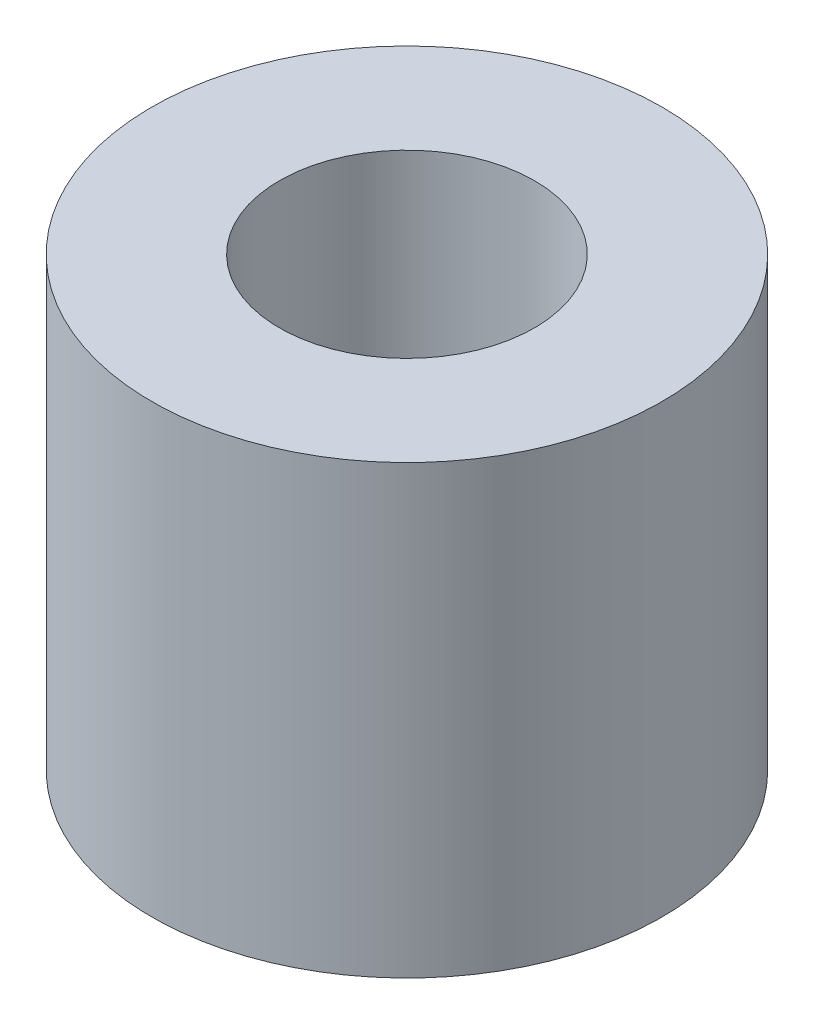
ISO-10303-21;
HEADER;
FILE_DESCRIPTION(('STEP AP214'),'2;1');
FILE_NAME('part.step','',(''),(''),'','','');
FILE_SCHEMA(('AUTOMOTIVE_DESIGN { 1 0 10303 214 1 1 1 1 }'));
ENDSEC;
DATA;
#1=APPLICATION_CONTEXT('core data for automotive mechanical design processes');
#2=APPLICATION_PROTOCOL_DEFINITION('international standard','automotive_design',2000,#1);
#3=PRODUCT_CONTEXT('',#1,'mechanical');
#4=PRODUCT('Part','Part','',(#3));
#5=PRODUCT_RELATED_PRODUCT_CATEGORY('part','',(#4));
#6=PRODUCT_DEFINITION_FORMATION('','',#4);
#7=PRODUCT_DEFINITION_CONTEXT('part definition',#1,'design');
#8=PRODUCT_DEFINITION('design','',#6,#7);
#9=PRODUCT_DEFINITION_SHAPE('','',#8);
#10=(LENGTH_UNIT() NAMED_UNIT(*) SI_UNIT(.MILLI.,.METRE.));
#11=(NAMED_UNIT(*) PLANE_ANGLE_UNIT() SI_UNIT($,.RADIAN.));
#12=(NAMED_UNIT(*) SI_UNIT($,.STERADIAN.) SOLID_ANGLE_UNIT());
#13=UNCERTAINTY_MEASURE_WITH_UNIT(LENGTH_MEASURE(1.E-05),#10,'distance_accuracy_value','');
#14=(GEOMETRIC_REPRESENTATION_CONTEXT(3) GLOBAL_UNCERTAINTY_ASSIGNED_CONTEXT((#13)) GLOBAL_UNIT_ASSIGNED_CONTEXT((#10,
#11,#12)) REPRESENTATION_CONTEXT('',''));
#15=CARTESIAN_POINT('',(0.,0.,0.));
#16=DIRECTION('',(0.,0.,1.));
#17=DIRECTION('',(1.,0.,0.));
#18=AXIS2_PLACEMENT_3D('',#15,#16,#17);
#19=CARTESIAN_POINT('',(0.,5.25,0.));
#20=DIRECTION('',(0.,1.,0.));
#21=DIRECTION('',(0.,0.,1.));
#22=AXIS2_PLACEMENT_3D('',#19,#20,#21);
#23=PLANE('',#22);
#24=CARTESIAN_POINT('',(0.,5.25,0.));
#25=DIRECTION('',(0.,1.,0.));
#26=DIRECTION('',(0.,0.,1.));
#27=AXIS2_PLACEMENT_3D('',#24,#25,#26);
#28=CIRCLE('',#27,3.);
#29=CARTESIAN_POINT('',(0.,5.25,-3.));
#30=VERTEX_POINT('',#29);
#31=EDGE_CURVE('E10',#30,#30,#28,.T.);
#32=ORIENTED_EDGE('',*,*,#31,.T.);
#33=EDGE_LOOP('',(#32));
#34=FACE_BOUND('',#33,.T.);
#35=CARTESIAN_POINT('',(0.,5.25,0.));
#36=DIRECTION('',(0.,1.,0.));
#37=DIRECTION('',(0.,0.,1.));
#38=AXIS2_PLACEMENT_3D('',#35,#36,#37);
#39=CIRCLE('',#38,1.5);
#40=CARTESIAN_POINT('',(0.,5.25,-1.5));
#41=VERTEX_POINT('',#40);
#42=EDGE_CURVE('E56',#41,#41,#39,.T.);
#43=ORIENTED_EDGE('',*,*,#42,.F.);
#44=EDGE_LOOP('',(#43));
#45=FACE_BOUND('',#44,.T.);
#46=ADVANCED_FACE('F43',(#34,#45),#23,.T.);
#47=CARTESIAN_POINT('',(0.,0.,0.));
#48=DIRECTION('',(0.,1.,0.));
#49=DIRECTION('',(0.,0.,1.));
#50=AXIS2_PLACEMENT_3D('',#47,#48,#49);
#51=PLANE('',#50);
#52=CARTESIAN_POINT('',(0.,0.,0.));
#53=DIRECTION('',(0.,1.,0.));
#54=DIRECTION('',(0.,0.,1.));
#55=AXIS2_PLACEMENT_3D('',#52,#53,#54);
#56=CIRCLE('',#55,3.);
#57=CARTESIAN_POINT('',(0.,0.,-3.));
#58=VERTEX_POINT('',#57);
#59=EDGE_CURVE('E47',#58,#58,#56,.T.);
#60=ORIENTED_EDGE('',*,*,#59,.F.);
#61=EDGE_LOOP('',(#60));
#62=FACE_BOUND('',#61,.T.);
#63=CARTESIAN_POINT('',(0.,0.,0.));
#64=DIRECTION('',(0.,1.,0.));
#65=DIRECTION('',(0.,0.,1.));
#66=AXIS2_PLACEMENT_3D('',#63,#64,#65);
#67=CIRCLE('',#66,1.5);
#68=CARTESIAN_POINT('',(0.,0.,-1.5));
#69=VERTEX_POINT('',#68);
#70=EDGE_CURVE('E58',#69,#69,#67,.T.);
#71=ORIENTED_EDGE('',*,*,#70,.T.);
#72=EDGE_LOOP('',(#71));
#73=FACE_BOUND('',#72,.T.);
#74=ADVANCED_FACE('F70',(#62,#73),#51,.F.);
#75=CARTESIAN_POINT('',(0.,5.25,0.));
#76=DIRECTION('',(0.,-1.,0.));
#77=DIRECTION('',(0.,0.,-1.));
#78=AXIS2_PLACEMENT_3D('',#75,#76,#77);
#79=CYLINDRICAL_SURFACE('',#78,3.);
#80=CARTESIAN_POINT('',(0.,5.25,-3.));
#81=CARTESIAN_POINT('',(0.,5.1953125,-3.));
#82=CARTESIAN_POINT('',(0.,5.140625,-3.));
#83=CARTESIAN_POINT('',(0.,5.03125,-3.));
#84=CARTESIAN_POINT('',(0.,4.9765625,-3.));
#85=CARTESIAN_POINT('',(0.,4.8671875,-3.));
#86=CARTESIAN_POINT('',(0.,4.8125,-3.));
#87=CARTESIAN_POINT('',(0.,4.703125,-3.));
#88=CARTESIAN_POINT('',(0.,4.6484375,-3.));
#89=CARTESIAN_POINT('',(0.,4.5390625,-3.));
#90=CARTESIAN_POINT('',(0.,4.484375,-3.));
#91=CARTESIAN_POINT('',(0.,4.375,-3.));
#92=CARTESIAN_POINT('',(0.,4.3203125,-3.));
#93=CARTESIAN_POINT('',(0.,4.2109375,-3.));
#94=CARTESIAN_POINT('',(0.,4.15625,-3.));
#95=CARTESIAN_POINT('',(0.,4.046875,-3.));
#96=CARTESIAN_POINT('',(0.,3.9921875,-3.));
#97=CARTESIAN_POINT('',(0.,3.8828125,-3.));
#98=CARTESIAN_POINT('',(0.,3.828125,-3.));
#99=CARTESIAN_POINT('',(0.,3.71875,-3.));
#100=CARTESIAN_POINT('',(0.,3.6640625,-3.));
#101=CARTESIAN_POINT('',(0.,3.5546875,-3.));
#102=CARTESIAN_POINT('',(0.,3.5,-3.));
#103=CARTESIAN_POINT('',(0.,3.390625,-3.));
#104=CARTESIAN_POINT('',(0.,3.3359375,-3.));
#105=CARTESIAN_POINT('',(0.,3.2265625,-3.));
#106=CARTESIAN_POINT('',(0.,3.171875,-3.));
#107=CARTESIAN_POINT('',(0.,3.0625,-3.));
#108=CARTESIAN_POINT('',(0.,3.0078125,-3.));
#109=CARTESIAN_POINT('',(0.,2.8984375,-3.));
#110=CARTESIAN_POINT('',(0.,2.84375,-3.));
#111=CARTESIAN_POINT('',(0.,2.734375,-3.));
#112=CARTESIAN_POINT('',(0.,2.6796875,-3.));
#113=CARTESIAN_POINT('',(0.,2.5703125,-3.));
#114=CARTESIAN_POINT('',(0.,2.515625,-3.));
#115=CARTESIAN_POINT('',(0.,2.40625,-3.));
#116=CARTESIAN_POINT('',(0.,2.3515625,-3.));
#117=CARTESIAN_POINT('',(0.,2.2421875,-3.));
#118=CARTESIAN_POINT('',(0.,2.1875,-3.));
#119=CARTESIAN_POINT('',(0.,2.078125,-3.));
#120=CARTESIAN_POINT('',(0.,2.0234375,-3.));
#121=CARTESIAN_POINT('',(0.,1.9140625,-3.));
#122=CARTESIAN_POINT('',(0.,1.859375,-3.));
#123=CARTESIAN_POINT('',(0.,1.75,-3.));
#124=CARTESIAN_POINT('',(0.,1.6953125,-3.));
#125=CARTESIAN_POINT('',(0.,1.5859375,-3.));
#126=CARTESIAN_POINT('',(0.,1.53125,-3.));
#127=CARTESIAN_POINT('',(0.,1.421875,-3.));
#128=CARTESIAN_POINT('',(0.,1.3671875,-3.));
#129=CARTESIAN_POINT('',(0.,1.2578125,-3.));
#130=CARTESIAN_POINT('',(0.,1.203125,-3.));
#131=CARTESIAN_POINT('',(0.,1.09375,-3.));
#132=CARTESIAN_POINT('',(0.,1.0390625,-3.));
#133=CARTESIAN_POINT('',(0.,0.9296875,-3.));
#134=CARTESIAN_POINT('',(0.,0.875,-3.));
#135=CARTESIAN_POINT('',(0.,0.765625,-3.));
#136=CARTESIAN_POINT('',(0.,0.7109375,-3.));
#137=CARTESIAN_POINT('',(0.,0.6015625,-3.));
#138=CARTESIAN_POINT('',(0.,0.546875,-3.));
#139=CARTESIAN_POINT('',(0.,0.4375,-3.));
#140=CARTESIAN_POINT('',(0.,0.3828125,-3.));
#141=CARTESIAN_POINT('',(0.,0.2734375,-3.));
#142=CARTESIAN_POINT('',(0.,0.21875,-3.));
#143=CARTESIAN_POINT('',(0.,0.109375,-3.));
#144=CARTESIAN_POINT('',(0.,0.0546875,-3.));
#145=CARTESIAN_POINT('',(0.,0.,-3.));
#146=B_SPLINE_CURVE_WITH_KNOTS('',3,(#80,#81,#82,#83,#84,#85,#86,#87,#88,#89,#90,#91,#92,#93,
#94,#95,#96,#97,#98,#99,#100,#101,#102,#103,#104,#105,#106,#107,#108,#109,#110,#111,#112,#113,
#114,#115,#116,#117,#118,#119,#120,#121,#122,#123,#124,#125,#126,#127,#128,#129,#130,#131,#132,
#133,#134,#135,#136,#137,#138,#139,#140,#141,#142,#143,#144,#145),.UNSPECIFIED.,.F.,.F.,(4,2,2,
2,2,2,2,2,2,2,2,2,2,2,2,2,2,2,2,2,2,2,2,2,2,2,2,2,2,2,2,2,4),(0.,0.164062499999999,
0.328124999999999,0.4921875,0.65625,0.8203125,0.984374999999999,1.1484375,1.3125,1.4765625,
1.640625,1.8046875,1.96875,2.1328125,2.296875,2.4609375,2.625,2.7890625,2.953125,3.1171875,
3.28125,3.4453125,3.609375,3.7734375,3.9375,4.1015625,4.265625,4.4296875,4.59375,4.7578125,
4.921875,5.0859375,5.25),.UNSPECIFIED.);
#147=EDGE_CURVE('BSEAM45',#30,#58,#146,.T.);
#148=ORIENTED_EDGE('',*,*,#31,.F.);
#149=ORIENTED_EDGE('',*,*,#59,.T.);
#150=ORIENTED_EDGE('',*,*,#147,.T.);
#151=ORIENTED_EDGE('',*,*,#147,.F.);
#152=EDGE_LOOP('',(#148,#150,#149,#151));
#153=FACE_BOUND('',#152,.T.);
#154=ADVANCED_FACE('F45',(#153),#79,.T.);
#155=CARTESIAN_POINT('',(0.,5.25,0.));
#156=DIRECTION('',(0.,-1.,0.));
#157=DIRECTION('',(0.,0.,-1.));
#158=AXIS2_PLACEMENT_3D('',#155,#156,#157);
#159=CYLINDRICAL_SURFACE('',#158,1.5);
#160=CARTESIAN_POINT('',(0.,5.25,-1.5));
#161=CARTESIAN_POINT('',(0.,5.1953125,-1.5));
#162=CARTESIAN_POINT('',(0.,5.140625,-1.5));
#163=CARTESIAN_POINT('',(0.,5.03125,-1.5));
#164=CARTESIAN_POINT('',(0.,4.9765625,-1.5));
#165=CARTESIAN_POINT('',(0.,4.8671875,-1.5));
#166=CARTESIAN_POINT('',(0.,4.8125,-1.5));
#167=CARTESIAN_POINT('',(0.,4.703125,-1.5));
#168=CARTESIAN_POINT('',(0.,4.6484375,-1.5));
#169=CARTESIAN_POINT('',(0.,4.5390625,-1.5));
#170=CARTESIAN_POINT('',(0.,4.484375,-1.5));
#171=CARTESIAN_POINT('',(0.,4.375,-1.5));
#172=CARTESIAN_POINT('',(0.,4.3203125,-1.5));
#173=CARTESIAN_POINT('',(0.,4.2109375,-1.5));
#174=CARTESIAN_POINT('',(0.,4.15625,-1.5));
#175=CARTESIAN_POINT('',(0.,4.046875,-1.5));
#176=CARTESIAN_POINT('',(0.,3.9921875,-1.5));
#177=CARTESIAN_POINT('',(0.,3.8828125,-1.5));
#178=CARTESIAN_POINT('',(0.,3.828125,-1.5));
#179=CARTESIAN_POINT('',(0.,3.71875,-1.5));
#180=CARTESIAN_POINT('',(0.,3.6640625,-1.5));
#181=CARTESIAN_POINT('',(0.,3.5546875,-1.5));
#182=CARTESIAN_POINT('',(0.,3.5,-1.5));
#183=CARTESIAN_POINT('',(0.,3.390625,-1.5));
#184=CARTESIAN_POINT('',(0.,3.3359375,-1.5));
#185=CARTESIAN_POINT('',(0.,3.2265625,-1.5));
#186=CARTESIAN_POINT('',(0.,3.171875,-1.5));
#187=CARTESIAN_POINT('',(0.,3.0625,-1.5));
#188=CARTESIAN_POINT('',(0.,3.0078125,-1.5));
#189=CARTESIAN_POINT('',(0.,2.8984375,-1.5));
#190=CARTESIAN_POINT('',(0.,2.84375,-1.5));
#191=CARTESIAN_POINT('',(0.,2.734375,-1.5));
#192=CARTESIAN_POINT('',(0.,2.6796875,-1.5));
#193=CARTESIAN_POINT('',(0.,2.5703125,-1.5));
#194=CARTESIAN_POINT('',(0.,2.515625,-1.5));
#195=CARTESIAN_POINT('',(0.,2.40625,-1.5));
#196=CARTESIAN_POINT('',(0.,2.3515625,-1.5));
#197=CARTESIAN_POINT('',(0.,2.2421875,-1.5));
#198=CARTESIAN_POINT('',(0.,2.1875,-1.5));
#199=CARTESIAN_POINT('',(0.,2.078125,-1.5));
#200=CARTESIAN_POINT('',(0.,2.0234375,-1.5));
#201=CARTESIAN_POINT('',(0.,1.9140625,-1.5));
#202=CARTESIAN_POINT('',(0.,1.859375,-1.5));
#203=CARTESIAN_POINT('',(0.,1.75,-1.5));
#204=CARTESIAN_POINT('',(0.,1.6953125,-1.5));
#205=CARTESIAN_POINT('',(0.,1.5859375,-1.5));
#206=CARTESIAN_POINT('',(0.,1.53125,-1.5));
#207=CARTESIAN_POINT('',(0.,1.421875,-1.5));
#208=CARTESIAN_POINT('',(0.,1.3671875,-1.5));
#209=CARTESIAN_POINT('',(0.,1.2578125,-1.5));
#210=CARTESIAN_POINT('',(0.,1.203125,-1.5));
#211=CARTESIAN_POINT('',(0.,1.09375,-1.5));
#212=CARTESIAN_POINT('',(0.,1.0390625,-1.5));
#213=CARTESIAN_POINT('',(0.,0.9296875,-1.5));
#214=CARTESIAN_POINT('',(0.,0.875,-1.5));
#215=CARTESIAN_POINT('',(0.,0.765625,-1.5));
#216=CARTESIAN_POINT('',(0.,0.7109375,-1.5));
#217=CARTESIAN_POINT('',(0.,0.6015625,-1.5));
#218=CARTESIAN_POINT('',(0.,0.546875,-1.5));
#219=CARTESIAN_POINT('',(0.,0.4375,-1.5));
#220=CARTESIAN_POINT('',(0.,0.3828125,-1.5));
#221=CARTESIAN_POINT('',(0.,0.2734375,-1.5));
#222=CARTESIAN_POINT('',(0.,0.21875,-1.5));
#223=CARTESIAN_POINT('',(0.,0.109375,-1.5));
#224=CARTESIAN_POINT('',(0.,0.0546875,-1.5));
#225=CARTESIAN_POINT('',(0.,0.,-1.5));
#226=B_SPLINE_CURVE_WITH_KNOTS('',3,(#160,#161,#162,#163,#164,#165,#166,#167,#168,#169,#170,
#171,#172,#173,#174,#175,#176,#177,#178,#179,#180,#181,#182,#183,#184,#185,#186,#187,#188,#189,
#190,#191,#192,#193,#194,#195,#196,#197,#198,#199,#200,#201,#202,#203,#204,#205,#206,#207,#208,
#209,#210,#211,#212,#213,#214,#215,#216,#217,#218,#219,#220,#221,#222,#223,#224,#225),
.UNSPECIFIED.,.F.,.F.,(4,2,2,2,2,2,2,2,2,2,2,2,2,2,2,2,2,2,2,2,2,2,2,2,2,2,2,2,2,2,2,2,4),(0.,
0.164062499999999,0.328124999999999,0.4921875,0.65625,0.8203125,0.984374999999999,1.1484375,
1.3125,1.4765625,1.640625,1.8046875,1.96875,2.1328125,2.296875,2.4609375,2.625,2.7890625,
2.953125,3.1171875,3.28125,3.4453125,3.609375,3.7734375,3.9375,4.1015625,4.265625,4.4296875,
4.59375,4.7578125,4.921875,5.0859375,5.25),.UNSPECIFIED.);
#227=EDGE_CURVE('BSEAM66',#41,#69,#226,.T.);
#228=ORIENTED_EDGE('',*,*,#42,.T.);
#229=ORIENTED_EDGE('',*,*,#70,.F.);
#230=ORIENTED_EDGE('',*,*,#227,.T.);
#231=ORIENTED_EDGE('',*,*,#227,.F.);
#232=EDGE_LOOP('',(#228,#230,#229,#231));
#233=FACE_BOUND('',#232,.T.);
#234=ADVANCED_FACE('F66',(#233),#159,.F.);
#235=CLOSED_SHELL('',(#46,#74,#154,#234));
#236=MANIFOLD_SOLID_BREP('B2',#235);
#237=ADVANCED_BREP_SHAPE_REPRESENTATION('',(#18,#236),#14);
#238=SHAPE_DEFINITION_REPRESENTATION(#9,#237);
ENDSEC;
END-ISO-10303-21;
